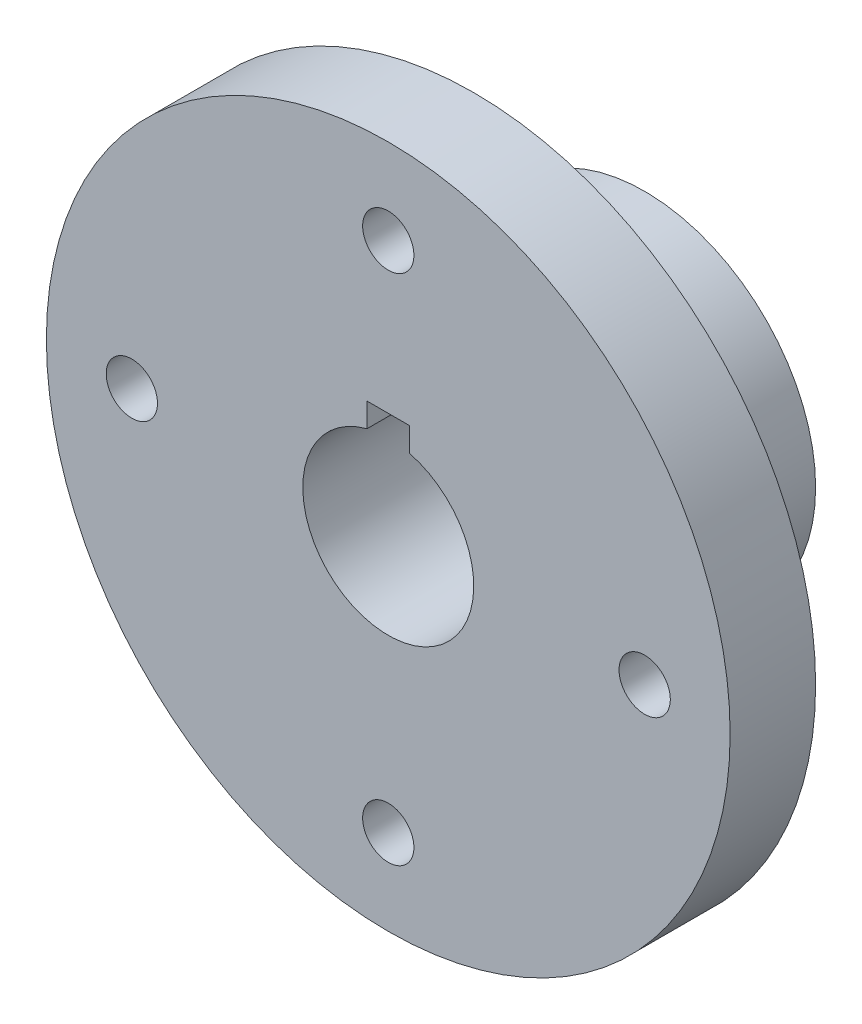
ISO-10303-21;
HEADER;
FILE_DESCRIPTION(('STEP AP214'),'2;1');
FILE_NAME('part.step','',(''),(''),'','','');
FILE_SCHEMA(('AUTOMOTIVE_DESIGN { 1 0 10303 214 1 1 1 1 }'));
ENDSEC;
DATA;
#1=APPLICATION_CONTEXT('core data for automotive mechanical design processes');
#2=APPLICATION_PROTOCOL_DEFINITION('international standard','automotive_design',2000,#1);
#3=PRODUCT_CONTEXT('',#1,'mechanical');
#4=PRODUCT('Part','Part','',(#3));
#5=PRODUCT_RELATED_PRODUCT_CATEGORY('part','',(#4));
#6=PRODUCT_DEFINITION_FORMATION('','',#4);
#7=PRODUCT_DEFINITION_CONTEXT('part definition',#1,'design');
#8=PRODUCT_DEFINITION('design','',#6,#7);
#9=PRODUCT_DEFINITION_SHAPE('','',#8);
#10=(LENGTH_UNIT() NAMED_UNIT(*) SI_UNIT(.MILLI.,.METRE.));
#11=(NAMED_UNIT(*) PLANE_ANGLE_UNIT() SI_UNIT($,.RADIAN.));
#12=(NAMED_UNIT(*) SI_UNIT($,.STERADIAN.) SOLID_ANGLE_UNIT());
#13=UNCERTAINTY_MEASURE_WITH_UNIT(LENGTH_MEASURE(1.E-05),#10,'distance_accuracy_value','');
#14=(GEOMETRIC_REPRESENTATION_CONTEXT(3) GLOBAL_UNCERTAINTY_ASSIGNED_CONTEXT((#13)) GLOBAL_UNIT_ASSIGNED_CONTEXT((#10,
#11,#12)) REPRESENTATION_CONTEXT('',''));
#15=CARTESIAN_POINT('',(0.,0.,0.));
#16=DIRECTION('',(0.,0.,1.));
#17=DIRECTION('',(1.,0.,0.));
#18=AXIS2_PLACEMENT_3D('',#15,#16,#17);
#19=CARTESIAN_POINT('',(0.,0.,50.));
#20=DIRECTION('',(0.,0.,-1.));
#21=DIRECTION('',(-1.,0.,0.));
#22=AXIS2_PLACEMENT_3D('',#19,#20,#21);
#23=CYLINDRICAL_SURFACE('',#22,200.);
#24=CARTESIAN_POINT('',(0.,0.,50.));
#25=DIRECTION('',(0.,0.,1.));
#26=DIRECTION('',(1.,0.,0.));
#27=AXIS2_PLACEMENT_3D('',#24,#25,#26);
#28=CIRCLE('',#27,200.);
#29=CARTESIAN_POINT('',(200.,0.,50.));
#30=VERTEX_POINT('',#29);
#31=EDGE_CURVE('E153',#30,#30,#28,.T.);
#32=ORIENTED_EDGE('',*,*,#31,.F.);
#33=EDGE_LOOP('',(#32));
#34=FACE_BOUND('',#33,.T.);
#35=CARTESIAN_POINT('',(0.,0.,0.));
#36=DIRECTION('',(0.,0.,1.));
#37=DIRECTION('',(1.,0.,0.));
#38=AXIS2_PLACEMENT_3D('',#35,#36,#37);
#39=CIRCLE('',#38,200.);
#40=CARTESIAN_POINT('',(200.,0.,0.));
#41=VERTEX_POINT('',#40);
#42=EDGE_CURVE('E147',#41,#41,#39,.T.);
#43=ORIENTED_EDGE('',*,*,#42,.T.);
#44=EDGE_LOOP('',(#43));
#45=FACE_BOUND('',#44,.T.);
#46=ADVANCED_FACE('F43',(#34,#45),#23,.T.);
#47=CARTESIAN_POINT('',(0.,0.,50.));
#48=DIRECTION('',(0.,0.,1.));
#49=DIRECTION('',(1.,0.,0.));
#50=AXIS2_PLACEMENT_3D('',#47,#48,#49);
#51=PLANE('',#50);
#52=DIRECTION('',(0.,1.,0.));
#53=VECTOR('',#52,1.);
#54=CARTESIAN_POINT('',(12.5,62.5,50.));
#55=LINE('',#54,#53);
#56=CARTESIAN_POINT('',(12.5,48.4122918275927,50.));
#57=VERTEX_POINT('',#56);
#58=CARTESIAN_POINT('',(12.5,62.5,50.));
#59=VERTEX_POINT('',#58);
#60=EDGE_CURVE('E87',#57,#59,#55,.T.);
#61=ORIENTED_EDGE('',*,*,#60,.F.);
#62=CARTESIAN_POINT('',(0.,0.,50.));
#63=DIRECTION('',(0.,0.,1.));
#64=DIRECTION('',(1.,0.,0.));
#65=AXIS2_PLACEMENT_3D('',#62,#63,#64);
#66=CIRCLE('',#65,50.);
#67=CARTESIAN_POINT('',(-12.5,48.4122918275927,50.));
#68=VERTEX_POINT('',#67);
#69=EDGE_CURVE('E119',#68,#57,#66,.T.);
#70=ORIENTED_EDGE('',*,*,#69,.F.);
#71=DIRECTION('',(0.,-1.,0.));
#72=VECTOR('',#71,1.);
#73=CARTESIAN_POINT('',(-12.5,62.5,50.));
#74=LINE('',#73,#72);
#75=CARTESIAN_POINT('',(-12.5,62.5,50.));
#76=VERTEX_POINT('',#75);
#77=EDGE_CURVE('E58',#76,#68,#74,.T.);
#78=ORIENTED_EDGE('',*,*,#77,.F.);
#79=DIRECTION('',(-1.,0.,0.));
#80=VECTOR('',#79,1.);
#81=CARTESIAN_POINT('',(-12.5,62.5,50.));
#82=LINE('',#81,#80);
#83=EDGE_CURVE('E109',#59,#76,#82,.T.);
#84=ORIENTED_EDGE('',*,*,#83,.F.);
#85=EDGE_LOOP('',(#61,#70,#78,#84));
#86=FACE_BOUND('',#85,.T.);
#87=CARTESIAN_POINT('',(0.,150.,50.));
#88=DIRECTION('',(0.,0.,1.));
#89=DIRECTION('',(1.,0.,0.));
#90=AXIS2_PLACEMENT_3D('',#87,#88,#89);
#91=CIRCLE('',#90,15.);
#92=CARTESIAN_POINT('',(15.,150.,50.));
#93=VERTEX_POINT('',#92);
#94=EDGE_CURVE('E127',#93,#93,#91,.T.);
#95=ORIENTED_EDGE('',*,*,#94,.F.);
#96=EDGE_LOOP('',(#95));
#97=FACE_BOUND('',#96,.T.);
#98=CARTESIAN_POINT('',(150.000000000004,4.23570186157978E-12,50.));
#99=DIRECTION('',(0.,0.,1.));
#100=DIRECTION('',(1.,0.,0.));
#101=AXIS2_PLACEMENT_3D('',#98,#99,#100);
#102=CIRCLE('',#101,15.0000000000033);
#103=CARTESIAN_POINT('',(165.000000000008,4.23570186157978E-12,50.));
#104=VERTEX_POINT('',#103);
#105=EDGE_CURVE('E132',#104,#104,#102,.T.);
#106=ORIENTED_EDGE('',*,*,#105,.F.);
#107=EDGE_LOOP('',(#106));
#108=FACE_BOUND('',#107,.T.);
#109=CARTESIAN_POINT('',(8.47140372315957E-12,-150.,50.));
#110=DIRECTION('',(0.,0.,1.));
#111=DIRECTION('',(1.,0.,0.));
#112=AXIS2_PLACEMENT_3D('',#109,#110,#111);
#113=CIRCLE('',#112,15.0000000000091);
#114=CARTESIAN_POINT('',(15.0000000000176,-150.,50.));
#115=VERTEX_POINT('',#114);
#116=EDGE_CURVE('E136',#115,#115,#113,.T.);
#117=ORIENTED_EDGE('',*,*,#116,.F.);
#118=EDGE_LOOP('',(#117));
#119=FACE_BOUND('',#118,.T.);
#120=CARTESIAN_POINT('',(-149.999999999996,-4.254071563567E-12,50.));
#121=DIRECTION('',(0.,0.,1.));
#122=DIRECTION('',(1.,0.,0.));
#123=AXIS2_PLACEMENT_3D('',#120,#121,#122);
#124=CIRCLE('',#123,15.0000000000068);
#125=CARTESIAN_POINT('',(-134.999999999989,-4.254071563567E-12,50.));
#126=VERTEX_POINT('',#125);
#127=EDGE_CURVE('E123',#126,#126,#124,.T.);
#128=ORIENTED_EDGE('',*,*,#127,.F.);
#129=EDGE_LOOP('',(#128));
#130=FACE_BOUND('',#129,.T.);
#131=ORIENTED_EDGE('',*,*,#31,.T.);
#132=EDGE_LOOP('',(#131));
#133=FACE_BOUND('',#132,.T.);
#134=ADVANCED_FACE('F178',(#86,#97,#108,#119,#130,#133),#51,.T.);
#135=CARTESIAN_POINT('',(0.,0.,0.));
#136=DIRECTION('',(0.,0.,1.));
#137=DIRECTION('',(1.,0.,0.));
#138=AXIS2_PLACEMENT_3D('',#135,#136,#137);
#139=PLANE('',#138);
#140=CARTESIAN_POINT('',(0.,150.,0.));
#141=DIRECTION('',(0.,0.,1.));
#142=DIRECTION('',(1.,0.,0.));
#143=AXIS2_PLACEMENT_3D('',#140,#141,#142);
#144=CIRCLE('',#143,15.);
#145=CARTESIAN_POINT('',(15.,150.,0.));
#146=VERTEX_POINT('',#145);
#147=EDGE_CURVE('E148',#146,#146,#144,.T.);
#148=ORIENTED_EDGE('',*,*,#147,.T.);
#149=EDGE_LOOP('',(#148));
#150=FACE_BOUND('',#149,.T.);
#151=CARTESIAN_POINT('',(150.000000000004,4.23570186157978E-12,0.));
#152=DIRECTION('',(0.,0.,1.));
#153=DIRECTION('',(1.,0.,0.));
#154=AXIS2_PLACEMENT_3D('',#151,#152,#153);
#155=CIRCLE('',#154,15.0000000000033);
#156=CARTESIAN_POINT('',(165.000000000008,4.23570186157978E-12,0.));
#157=VERTEX_POINT('',#156);
#158=EDGE_CURVE('E167',#157,#157,#155,.T.);
#159=ORIENTED_EDGE('',*,*,#158,.T.);
#160=EDGE_LOOP('',(#159));
#161=FACE_BOUND('',#160,.T.);
#162=CARTESIAN_POINT('',(8.47140372315957E-12,-150.,0.));
#163=DIRECTION('',(0.,0.,1.));
#164=DIRECTION('',(1.,0.,0.));
#165=AXIS2_PLACEMENT_3D('',#162,#163,#164);
#166=CIRCLE('',#165,15.0000000000091);
#167=CARTESIAN_POINT('',(15.0000000000176,-150.,0.));
#168=VERTEX_POINT('',#167);
#169=EDGE_CURVE('E163',#168,#168,#166,.T.);
#170=ORIENTED_EDGE('',*,*,#169,.T.);
#171=EDGE_LOOP('',(#170));
#172=FACE_BOUND('',#171,.T.);
#173=CARTESIAN_POINT('',(-149.999999999996,-4.254071563567E-12,0.));
#174=DIRECTION('',(0.,0.,1.));
#175=DIRECTION('',(1.,0.,0.));
#176=AXIS2_PLACEMENT_3D('',#173,#174,#175);
#177=CIRCLE('',#176,15.0000000000068);
#178=CARTESIAN_POINT('',(-134.999999999989,-4.254071563567E-12,0.));
#179=VERTEX_POINT('',#178);
#180=EDGE_CURVE('E131',#179,#179,#177,.T.);
#181=ORIENTED_EDGE('',*,*,#180,.T.);
#182=EDGE_LOOP('',(#181));
#183=FACE_BOUND('',#182,.T.);
#184=CARTESIAN_POINT('',(0.,0.,0.));
#185=DIRECTION('',(0.,0.,-1.));
#186=DIRECTION('',(-1.,0.,0.));
#187=AXIS2_PLACEMENT_3D('',#184,#185,#186);
#188=CIRCLE('',#187,100.);
#189=CARTESIAN_POINT('',(100.,0.,0.));
#190=VERTEX_POINT('',#189);
#191=EDGE_CURVE('E149',#190,#190,#188,.T.);
#192=ORIENTED_EDGE('',*,*,#191,.F.);
#193=EDGE_LOOP('',(#192));
#194=FACE_BOUND('',#193,.T.);
#195=ORIENTED_EDGE('',*,*,#42,.F.);
#196=EDGE_LOOP('',(#195));
#197=FACE_BOUND('',#196,.T.);
#198=ADVANCED_FACE('F181',(#150,#161,#172,#183,#194,#197),#139,.F.);
#199=CARTESIAN_POINT('',(0.,0.,-100.));
#200=DIRECTION('',(0.,0.,1.));
#201=DIRECTION('',(1.,0.,0.));
#202=AXIS2_PLACEMENT_3D('',#199,#200,#201);
#203=CYLINDRICAL_SURFACE('',#202,100.);
#204=CARTESIAN_POINT('',(0.,0.,-100.));
#205=DIRECTION('',(0.,0.,-1.));
#206=DIRECTION('',(-1.,0.,0.));
#207=AXIS2_PLACEMENT_3D('',#204,#205,#206);
#208=CIRCLE('',#207,100.);
#209=CARTESIAN_POINT('',(100.,0.,-100.));
#210=VERTEX_POINT('',#209);
#211=EDGE_CURVE('E143',#210,#210,#208,.T.);
#212=CARTESIAN_POINT('',(100.,0.,-100.));
#213=CARTESIAN_POINT('',(100.,0.,-98.9583333333333));
#214=CARTESIAN_POINT('',(100.,0.,-97.9166666666667));
#215=CARTESIAN_POINT('',(100.,0.,-95.8333333333333));
#216=CARTESIAN_POINT('',(100.,0.,-94.7916666666666));
#217=CARTESIAN_POINT('',(100.,0.,-92.7083333333333));
#218=CARTESIAN_POINT('',(100.,0.,-91.6666666666666));
#219=CARTESIAN_POINT('',(100.,0.,-89.5833333333333));
#220=CARTESIAN_POINT('',(100.,0.,-88.5416666666666));
#221=CARTESIAN_POINT('',(100.,0.,-86.4583333333333));
#222=CARTESIAN_POINT('',(100.,0.,-85.4166666666667));
#223=CARTESIAN_POINT('',(100.,0.,-83.3333333333333));
#224=CARTESIAN_POINT('',(100.,0.,-82.2916666666667));
#225=CARTESIAN_POINT('',(100.,0.,-80.2083333333333));
#226=CARTESIAN_POINT('',(100.,0.,-79.1666666666666));
#227=CARTESIAN_POINT('',(100.,0.,-77.0833333333333));
#228=CARTESIAN_POINT('',(100.,0.,-76.0416666666666));
#229=CARTESIAN_POINT('',(100.,0.,-73.9583333333333));
#230=CARTESIAN_POINT('',(100.,0.,-72.9166666666667));
#231=CARTESIAN_POINT('',(100.,0.,-70.8333333333333));
#232=CARTESIAN_POINT('',(100.,0.,-69.7916666666667));
#233=CARTESIAN_POINT('',(100.,0.,-67.7083333333333));
#234=CARTESIAN_POINT('',(100.,0.,-66.6666666666667));
#235=CARTESIAN_POINT('',(100.,0.,-64.5833333333333));
#236=CARTESIAN_POINT('',(100.,0.,-63.5416666666667));
#237=CARTESIAN_POINT('',(100.,0.,-61.4583333333333));
#238=CARTESIAN_POINT('',(100.,0.,-60.4166666666667));
#239=CARTESIAN_POINT('',(100.,0.,-58.3333333333333));
#240=CARTESIAN_POINT('',(100.,0.,-57.2916666666667));
#241=CARTESIAN_POINT('',(100.,0.,-55.2083333333333));
#242=CARTESIAN_POINT('',(100.,0.,-54.1666666666667));
#243=CARTESIAN_POINT('',(100.,0.,-52.0833333333333));
#244=CARTESIAN_POINT('',(100.,0.,-51.0416666666667));
#245=CARTESIAN_POINT('',(100.,0.,-48.9583333333333));
#246=CARTESIAN_POINT('',(100.,0.,-47.9166666666667));
#247=CARTESIAN_POINT('',(100.,0.,-45.8333333333333));
#248=CARTESIAN_POINT('',(100.,0.,-44.7916666666667));
#249=CARTESIAN_POINT('',(100.,0.,-42.7083333333333));
#250=CARTESIAN_POINT('',(100.,0.,-41.6666666666667));
#251=CARTESIAN_POINT('',(100.,0.,-39.5833333333333));
#252=CARTESIAN_POINT('',(100.,0.,-38.5416666666667));
#253=CARTESIAN_POINT('',(100.,0.,-36.4583333333333));
#254=CARTESIAN_POINT('',(100.,0.,-35.4166666666667));
#255=CARTESIAN_POINT('',(100.,0.,-33.3333333333333));
#256=CARTESIAN_POINT('',(100.,0.,-32.2916666666667));
#257=CARTESIAN_POINT('',(100.,0.,-30.2083333333333));
#258=CARTESIAN_POINT('',(100.,0.,-29.1666666666667));
#259=CARTESIAN_POINT('',(100.,0.,-27.0833333333333));
#260=CARTESIAN_POINT('',(100.,0.,-26.0416666666667));
#261=CARTESIAN_POINT('',(100.,0.,-23.9583333333333));
#262=CARTESIAN_POINT('',(100.,0.,-22.9166666666667));
#263=CARTESIAN_POINT('',(100.,0.,-20.8333333333333));
#264=CARTESIAN_POINT('',(100.,0.,-19.7916666666667));
#265=CARTESIAN_POINT('',(100.,0.,-17.7083333333333));
#266=CARTESIAN_POINT('',(100.,0.,-16.6666666666667));
#267=CARTESIAN_POINT('',(100.,0.,-14.5833333333333));
#268=CARTESIAN_POINT('',(100.,0.,-13.5416666666667));
#269=CARTESIAN_POINT('',(100.,0.,-11.4583333333333));
#270=CARTESIAN_POINT('',(100.,0.,-10.4166666666667));
#271=CARTESIAN_POINT('',(100.,0.,-8.33333333333333));
#272=CARTESIAN_POINT('',(100.,0.,-7.29166666666667));
#273=CARTESIAN_POINT('',(100.,0.,-5.20833333333334));
#274=CARTESIAN_POINT('',(100.,0.,-4.16666666666667));
#275=CARTESIAN_POINT('',(100.,0.,-2.08333333333334));
#276=CARTESIAN_POINT('',(100.,0.,-1.04166666666667));
#277=CARTESIAN_POINT('',(100.,0.,0.));
#278=B_SPLINE_CURVE_WITH_KNOTS('',3,(#212,#213,#214,#215,#216,#217,#218,#219,#220,#221,#222,
#223,#224,#225,#226,#227,#228,#229,#230,#231,#232,#233,#234,#235,#236,#237,#238,#239,#240,#241,
#242,#243,#244,#245,#246,#247,#248,#249,#250,#251,#252,#253,#254,#255,#256,#257,#258,#259,#260,
#261,#262,#263,#264,#265,#266,#267,#268,#269,#270,#271,#272,#273,#274,#275,#276,#277),
.UNSPECIFIED.,.F.,.F.,(4,2,2,2,2,2,2,2,2,2,2,2,2,2,2,2,2,2,2,2,2,2,2,2,2,2,2,2,2,2,2,2,4),(0.,
3.125,6.25000000000001,9.37500000000001,12.5,15.625,18.75,21.875,25.,28.125,31.25,34.375,37.5,
40.625,43.75,46.875,50.,53.125,56.25,59.375,62.5,65.625,68.75,71.875,75.,78.125,81.25,84.375,
87.5,90.625,93.75,96.875,100.),.UNSPECIFIED.);
#279=EDGE_CURVE('BSEAM198',#210,#190,#278,.T.);
#280=ORIENTED_EDGE('',*,*,#211,.F.);
#281=ORIENTED_EDGE('',*,*,#191,.T.);
#282=ORIENTED_EDGE('',*,*,#279,.T.);
#283=ORIENTED_EDGE('',*,*,#279,.F.);
#284=EDGE_LOOP('',(#280,#282,#281,#283));
#285=FACE_BOUND('',#284,.T.);
#286=ADVANCED_FACE('F198',(#285),#203,.T.);
#287=CARTESIAN_POINT('',(0.,0.,-100.));
#288=DIRECTION('',(0.,0.,-1.));
#289=DIRECTION('',(-1.,0.,0.));
#290=AXIS2_PLACEMENT_3D('',#287,#288,#289);
#291=PLANE('',#290);
#292=DIRECTION('',(0.,1.,0.));
#293=VECTOR('',#292,1.);
#294=CARTESIAN_POINT('',(12.5,62.5,-100.));
#295=LINE('',#294,#293);
#296=CARTESIAN_POINT('',(12.5,48.4122918275927,-100.));
#297=VERTEX_POINT('',#296);
#298=CARTESIAN_POINT('',(12.5,62.5,-100.));
#299=VERTEX_POINT('',#298);
#300=EDGE_CURVE('E85',#297,#299,#295,.T.);
#301=ORIENTED_EDGE('',*,*,#300,.T.);
#302=DIRECTION('',(-1.,0.,0.));
#303=VECTOR('',#302,1.);
#304=CARTESIAN_POINT('',(-12.5,62.5,-100.));
#305=LINE('',#304,#303);
#306=CARTESIAN_POINT('',(-12.5,62.5,-100.));
#307=VERTEX_POINT('',#306);
#308=EDGE_CURVE('E96',#299,#307,#305,.T.);
#309=ORIENTED_EDGE('',*,*,#308,.T.);
#310=DIRECTION('',(0.,-1.,0.));
#311=VECTOR('',#310,1.);
#312=CARTESIAN_POINT('',(-12.5,62.5,-100.));
#313=LINE('',#312,#311);
#314=CARTESIAN_POINT('',(-12.5,48.4122918275927,-100.));
#315=VERTEX_POINT('',#314);
#316=EDGE_CURVE('E93',#307,#315,#313,.T.);
#317=ORIENTED_EDGE('',*,*,#316,.T.);
#318=CARTESIAN_POINT('',(0.,0.,-100.));
#319=DIRECTION('',(0.,0.,1.));
#320=DIRECTION('',(1.,0.,0.));
#321=AXIS2_PLACEMENT_3D('',#318,#319,#320);
#322=CIRCLE('',#321,50.);
#323=EDGE_CURVE('E105',#315,#297,#322,.T.);
#324=ORIENTED_EDGE('',*,*,#323,.T.);
#325=EDGE_LOOP('',(#301,#309,#317,#324));
#326=FACE_BOUND('',#325,.T.);
#327=ORIENTED_EDGE('',*,*,#211,.T.);
#328=EDGE_LOOP('',(#327));
#329=FACE_BOUND('',#328,.T.);
#330=ADVANCED_FACE('F102',(#326,#329),#291,.T.);
#331=CARTESIAN_POINT('',(-149.999999999996,-4.254071563567E-12,-50.));
#332=DIRECTION('',(0.,0.,1.));
#333=DIRECTION('',(1.,0.,0.));
#334=AXIS2_PLACEMENT_3D('',#331,#332,#333);
#335=CYLINDRICAL_SURFACE('',#334,15.0000000000068);
#336=CARTESIAN_POINT('',(-134.999999999989,-4.254071563567E-12,50.));
#337=CARTESIAN_POINT('',(-134.999999999989,-4.254071563567E-12,49.4791666666667));
#338=CARTESIAN_POINT('',(-134.999999999989,-4.254071563567E-12,48.9583333333333));
#339=CARTESIAN_POINT('',(-134.999999999989,-4.254071563567E-12,47.9166666666667));
#340=CARTESIAN_POINT('',(-134.999999999989,-4.254071563567E-12,47.3958333333333));
#341=CARTESIAN_POINT('',(-134.999999999989,-4.254071563567E-12,46.3541666666667));
#342=CARTESIAN_POINT('',(-134.999999999989,-4.254071563567E-12,45.8333333333333));
#343=CARTESIAN_POINT('',(-134.999999999989,-4.254071563567E-12,44.7916666666667));
#344=CARTESIAN_POINT('',(-134.999999999989,-4.254071563567E-12,44.2708333333333));
#345=CARTESIAN_POINT('',(-134.999999999989,-4.254071563567E-12,43.2291666666667));
#346=CARTESIAN_POINT('',(-134.999999999989,-4.254071563567E-12,42.7083333333333));
#347=CARTESIAN_POINT('',(-134.999999999989,-4.254071563567E-12,41.6666666666667));
#348=CARTESIAN_POINT('',(-134.999999999989,-4.254071563567E-12,41.1458333333333));
#349=CARTESIAN_POINT('',(-134.999999999989,-4.254071563567E-12,40.1041666666667));
#350=CARTESIAN_POINT('',(-134.999999999989,-4.254071563567E-12,39.5833333333333));
#351=CARTESIAN_POINT('',(-134.999999999989,-4.254071563567E-12,38.5416666666667));
#352=CARTESIAN_POINT('',(-134.999999999989,-4.254071563567E-12,38.0208333333333));
#353=CARTESIAN_POINT('',(-134.999999999989,-4.254071563567E-12,36.9791666666667));
#354=CARTESIAN_POINT('',(-134.999999999989,-4.254071563567E-12,36.4583333333333));
#355=CARTESIAN_POINT('',(-134.999999999989,-4.254071563567E-12,35.4166666666667));
#356=CARTESIAN_POINT('',(-134.999999999989,-4.254071563567E-12,34.8958333333333));
#357=CARTESIAN_POINT('',(-134.999999999989,-4.254071563567E-12,33.8541666666667));
#358=CARTESIAN_POINT('',(-134.999999999989,-4.254071563567E-12,33.3333333333333));
#359=CARTESIAN_POINT('',(-134.999999999989,-4.254071563567E-12,32.2916666666667));
#360=CARTESIAN_POINT('',(-134.999999999989,-4.254071563567E-12,31.7708333333333));
#361=CARTESIAN_POINT('',(-134.999999999989,-4.254071563567E-12,30.7291666666667));
#362=CARTESIAN_POINT('',(-134.999999999989,-4.254071563567E-12,30.2083333333333));
#363=CARTESIAN_POINT('',(-134.999999999989,-4.254071563567E-12,29.1666666666667));
#364=CARTESIAN_POINT('',(-134.999999999989,-4.254071563567E-12,28.6458333333333));
#365=CARTESIAN_POINT('',(-134.999999999989,-4.254071563567E-12,27.6041666666667));
#366=CARTESIAN_POINT('',(-134.999999999989,-4.254071563567E-12,27.0833333333333));
#367=CARTESIAN_POINT('',(-134.999999999989,-4.254071563567E-12,26.0416666666667));
#368=CARTESIAN_POINT('',(-134.999999999989,-4.254071563567E-12,25.5208333333333));
#369=CARTESIAN_POINT('',(-134.999999999989,-4.254071563567E-12,24.4791666666667));
#370=CARTESIAN_POINT('',(-134.999999999989,-4.254071563567E-12,23.9583333333333));
#371=CARTESIAN_POINT('',(-134.999999999989,-4.254071563567E-12,22.9166666666667));
#372=CARTESIAN_POINT('',(-134.999999999989,-4.254071563567E-12,22.3958333333333));
#373=CARTESIAN_POINT('',(-134.999999999989,-4.254071563567E-12,21.3541666666667));
#374=CARTESIAN_POINT('',(-134.999999999989,-4.254071563567E-12,20.8333333333333));
#375=CARTESIAN_POINT('',(-134.999999999989,-4.254071563567E-12,19.7916666666667));
#376=CARTESIAN_POINT('',(-134.999999999989,-4.254071563567E-12,19.2708333333333));
#377=CARTESIAN_POINT('',(-134.999999999989,-4.254071563567E-12,18.2291666666667));
#378=CARTESIAN_POINT('',(-134.999999999989,-4.254071563567E-12,17.7083333333333));
#379=CARTESIAN_POINT('',(-134.999999999989,-4.254071563567E-12,16.6666666666667));
#380=CARTESIAN_POINT('',(-134.999999999989,-4.254071563567E-12,16.1458333333333));
#381=CARTESIAN_POINT('',(-134.999999999989,-4.254071563567E-12,15.1041666666667));
#382=CARTESIAN_POINT('',(-134.999999999989,-4.254071563567E-12,14.5833333333333));
#383=CARTESIAN_POINT('',(-134.999999999989,-4.254071563567E-12,13.5416666666667));
#384=CARTESIAN_POINT('',(-134.999999999989,-4.254071563567E-12,13.0208333333333));
#385=CARTESIAN_POINT('',(-134.999999999989,-4.254071563567E-12,11.9791666666667));
#386=CARTESIAN_POINT('',(-134.999999999989,-4.254071563567E-12,11.4583333333333));
#387=CARTESIAN_POINT('',(-134.999999999989,-4.254071563567E-12,10.4166666666667));
#388=CARTESIAN_POINT('',(-134.999999999989,-4.254071563567E-12,9.89583333333333));
#389=CARTESIAN_POINT('',(-134.999999999989,-4.254071563567E-12,8.85416666666666));
#390=CARTESIAN_POINT('',(-134.999999999989,-4.254071563567E-12,8.33333333333333));
#391=CARTESIAN_POINT('',(-134.999999999989,-4.254071563567E-12,7.29166666666666));
#392=CARTESIAN_POINT('',(-134.999999999989,-4.254071563567E-12,6.77083333333333));
#393=CARTESIAN_POINT('',(-134.999999999989,-4.254071563567E-12,5.72916666666666));
#394=CARTESIAN_POINT('',(-134.999999999989,-4.254071563567E-12,5.20833333333333));
#395=CARTESIAN_POINT('',(-134.999999999989,-4.254071563567E-12,4.16666666666666));
#396=CARTESIAN_POINT('',(-134.999999999989,-4.254071563567E-12,3.64583333333333));
#397=CARTESIAN_POINT('',(-134.999999999989,-4.254071563567E-12,2.60416666666666));
#398=CARTESIAN_POINT('',(-134.999999999989,-4.254071563567E-12,2.08333333333333));
#399=CARTESIAN_POINT('',(-134.999999999989,-4.254071563567E-12,1.04166666666666));
#400=CARTESIAN_POINT('',(-134.999999999989,-4.254071563567E-12,0.520833333333327));
#401=CARTESIAN_POINT('',(-134.999999999989,-4.254071563567E-12,0.));
#402=B_SPLINE_CURVE_WITH_KNOTS('',3,(#336,#337,#338,#339,#340,#341,#342,#343,#344,#345,#346,
#347,#348,#349,#350,#351,#352,#353,#354,#355,#356,#357,#358,#359,#360,#361,#362,#363,#364,#365,
#366,#367,#368,#369,#370,#371,#372,#373,#374,#375,#376,#377,#378,#379,#380,#381,#382,#383,#384,
#385,#386,#387,#388,#389,#390,#391,#392,#393,#394,#395,#396,#397,#398,#399,#400,#401),
.UNSPECIFIED.,.F.,.F.,(4,2,2,2,2,2,2,2,2,2,2,2,2,2,2,2,2,2,2,2,2,2,2,2,2,2,2,2,2,2,2,2,4),(0.,
1.56249999999999,3.125,4.6875,6.25000000000001,7.8125,9.37500000000001,10.9375,12.5,14.0625,
15.625,17.1875,18.75,20.3125,21.875,23.4375,25.,26.5625,28.125,29.6875,31.25,32.8125,34.375,
35.9375,37.5,39.0625,40.625,42.1875,43.75,45.3125,46.875,48.4375,50.),.UNSPECIFIED.);
#403=EDGE_CURVE('BSEAM209',#126,#179,#402,.T.);
#404=ORIENTED_EDGE('',*,*,#127,.T.);
#405=ORIENTED_EDGE('',*,*,#180,.F.);
#406=ORIENTED_EDGE('',*,*,#403,.T.);
#407=ORIENTED_EDGE('',*,*,#403,.F.);
#408=EDGE_LOOP('',(#404,#406,#405,#407));
#409=FACE_BOUND('',#408,.T.);
#410=ADVANCED_FACE('F209',(#409),#335,.F.);
#411=CARTESIAN_POINT('',(8.47140372315957E-12,-150.,-50.));
#412=DIRECTION('',(0.,0.,1.));
#413=DIRECTION('',(1.,0.,0.));
#414=AXIS2_PLACEMENT_3D('',#411,#412,#413);
#415=CYLINDRICAL_SURFACE('',#414,15.0000000000091);
#416=CARTESIAN_POINT('',(15.0000000000176,-150.,50.));
#417=CARTESIAN_POINT('',(15.0000000000176,-150.,49.4791666666667));
#418=CARTESIAN_POINT('',(15.0000000000176,-150.,48.9583333333333));
#419=CARTESIAN_POINT('',(15.0000000000176,-150.,47.9166666666667));
#420=CARTESIAN_POINT('',(15.0000000000176,-150.,47.3958333333333));
#421=CARTESIAN_POINT('',(15.0000000000176,-150.,46.3541666666667));
#422=CARTESIAN_POINT('',(15.0000000000176,-150.,45.8333333333333));
#423=CARTESIAN_POINT('',(15.0000000000176,-150.,44.7916666666667));
#424=CARTESIAN_POINT('',(15.0000000000176,-150.,44.2708333333333));
#425=CARTESIAN_POINT('',(15.0000000000176,-150.,43.2291666666667));
#426=CARTESIAN_POINT('',(15.0000000000176,-150.,42.7083333333333));
#427=CARTESIAN_POINT('',(15.0000000000176,-150.,41.6666666666667));
#428=CARTESIAN_POINT('',(15.0000000000176,-150.,41.1458333333333));
#429=CARTESIAN_POINT('',(15.0000000000176,-150.,40.1041666666667));
#430=CARTESIAN_POINT('',(15.0000000000176,-150.,39.5833333333333));
#431=CARTESIAN_POINT('',(15.0000000000176,-150.,38.5416666666667));
#432=CARTESIAN_POINT('',(15.0000000000176,-150.,38.0208333333333));
#433=CARTESIAN_POINT('',(15.0000000000176,-150.,36.9791666666667));
#434=CARTESIAN_POINT('',(15.0000000000176,-150.,36.4583333333333));
#435=CARTESIAN_POINT('',(15.0000000000176,-150.,35.4166666666667));
#436=CARTESIAN_POINT('',(15.0000000000176,-150.,34.8958333333333));
#437=CARTESIAN_POINT('',(15.0000000000176,-150.,33.8541666666667));
#438=CARTESIAN_POINT('',(15.0000000000176,-150.,33.3333333333333));
#439=CARTESIAN_POINT('',(15.0000000000176,-150.,32.2916666666667));
#440=CARTESIAN_POINT('',(15.0000000000176,-150.,31.7708333333333));
#441=CARTESIAN_POINT('',(15.0000000000176,-150.,30.7291666666667));
#442=CARTESIAN_POINT('',(15.0000000000176,-150.,30.2083333333333));
#443=CARTESIAN_POINT('',(15.0000000000176,-150.,29.1666666666667));
#444=CARTESIAN_POINT('',(15.0000000000176,-150.,28.6458333333333));
#445=CARTESIAN_POINT('',(15.0000000000176,-150.,27.6041666666667));
#446=CARTESIAN_POINT('',(15.0000000000176,-150.,27.0833333333333));
#447=CARTESIAN_POINT('',(15.0000000000176,-150.,26.0416666666667));
#448=CARTESIAN_POINT('',(15.0000000000176,-150.,25.5208333333333));
#449=CARTESIAN_POINT('',(15.0000000000176,-150.,24.4791666666667));
#450=CARTESIAN_POINT('',(15.0000000000176,-150.,23.9583333333333));
#451=CARTESIAN_POINT('',(15.0000000000176,-150.,22.9166666666667));
#452=CARTESIAN_POINT('',(15.0000000000176,-150.,22.3958333333333));
#453=CARTESIAN_POINT('',(15.0000000000176,-150.,21.3541666666667));
#454=CARTESIAN_POINT('',(15.0000000000176,-150.,20.8333333333333));
#455=CARTESIAN_POINT('',(15.0000000000176,-150.,19.7916666666667));
#456=CARTESIAN_POINT('',(15.0000000000176,-150.,19.2708333333333));
#457=CARTESIAN_POINT('',(15.0000000000176,-150.,18.2291666666667));
#458=CARTESIAN_POINT('',(15.0000000000176,-150.,17.7083333333333));
#459=CARTESIAN_POINT('',(15.0000000000176,-150.,16.6666666666667));
#460=CARTESIAN_POINT('',(15.0000000000176,-150.,16.1458333333333));
#461=CARTESIAN_POINT('',(15.0000000000176,-150.,15.1041666666667));
#462=CARTESIAN_POINT('',(15.0000000000176,-150.,14.5833333333333));
#463=CARTESIAN_POINT('',(15.0000000000176,-150.,13.5416666666667));
#464=CARTESIAN_POINT('',(15.0000000000176,-150.,13.0208333333333));
#465=CARTESIAN_POINT('',(15.0000000000176,-150.,11.9791666666667));
#466=CARTESIAN_POINT('',(15.0000000000176,-150.,11.4583333333333));
#467=CARTESIAN_POINT('',(15.0000000000176,-150.,10.4166666666667));
#468=CARTESIAN_POINT('',(15.0000000000176,-150.,9.89583333333333));
#469=CARTESIAN_POINT('',(15.0000000000176,-150.,8.85416666666666));
#470=CARTESIAN_POINT('',(15.0000000000176,-150.,8.33333333333333));
#471=CARTESIAN_POINT('',(15.0000000000176,-150.,7.29166666666666));
#472=CARTESIAN_POINT('',(15.0000000000176,-150.,6.77083333333333));
#473=CARTESIAN_POINT('',(15.0000000000176,-150.,5.72916666666666));
#474=CARTESIAN_POINT('',(15.0000000000176,-150.,5.20833333333333));
#475=CARTESIAN_POINT('',(15.0000000000176,-150.,4.16666666666666));
#476=CARTESIAN_POINT('',(15.0000000000176,-150.,3.64583333333333));
#477=CARTESIAN_POINT('',(15.0000000000176,-150.,2.60416666666666));
#478=CARTESIAN_POINT('',(15.0000000000176,-150.,2.08333333333333));
#479=CARTESIAN_POINT('',(15.0000000000176,-150.,1.04166666666666));
#480=CARTESIAN_POINT('',(15.0000000000176,-150.,0.520833333333327));
#481=CARTESIAN_POINT('',(15.0000000000176,-150.,0.));
#482=B_SPLINE_CURVE_WITH_KNOTS('',3,(#416,#417,#418,#419,#420,#421,#422,#423,#424,#425,#426,
#427,#428,#429,#430,#431,#432,#433,#434,#435,#436,#437,#438,#439,#440,#441,#442,#443,#444,#445,
#446,#447,#448,#449,#450,#451,#452,#453,#454,#455,#456,#457,#458,#459,#460,#461,#462,#463,#464,
#465,#466,#467,#468,#469,#470,#471,#472,#473,#474,#475,#476,#477,#478,#479,#480,#481),
.UNSPECIFIED.,.F.,.F.,(4,2,2,2,2,2,2,2,2,2,2,2,2,2,2,2,2,2,2,2,2,2,2,2,2,2,2,2,2,2,2,2,4),(0.,
1.56249999999999,3.125,4.6875,6.25000000000001,7.8125,9.37500000000001,10.9375,12.5,14.0625,
15.625,17.1875,18.75,20.3125,21.875,23.4375,25.,26.5625,28.125,29.6875,31.25,32.8125,34.375,
35.9375,37.5,39.0625,40.625,42.1875,43.75,45.3125,46.875,48.4375,50.),.UNSPECIFIED.);
#483=EDGE_CURVE('BSEAM212',#115,#168,#482,.T.);
#484=ORIENTED_EDGE('',*,*,#116,.T.);
#485=ORIENTED_EDGE('',*,*,#169,.F.);
#486=ORIENTED_EDGE('',*,*,#483,.T.);
#487=ORIENTED_EDGE('',*,*,#483,.F.);
#488=EDGE_LOOP('',(#484,#486,#485,#487));
#489=FACE_BOUND('',#488,.T.);
#490=ADVANCED_FACE('F212',(#489),#415,.F.);
#491=CARTESIAN_POINT('',(150.000000000004,4.23570186157978E-12,-50.));
#492=DIRECTION('',(0.,0.,1.));
#493=DIRECTION('',(1.,0.,0.));
#494=AXIS2_PLACEMENT_3D('',#491,#492,#493);
#495=CYLINDRICAL_SURFACE('',#494,15.0000000000033);
#496=CARTESIAN_POINT('',(165.000000000008,4.23570186157978E-12,50.));
#497=CARTESIAN_POINT('',(165.000000000008,4.23570186157978E-12,49.4791666666667));
#498=CARTESIAN_POINT('',(165.000000000008,4.23570186157978E-12,48.9583333333333));
#499=CARTESIAN_POINT('',(165.000000000008,4.23570186157978E-12,47.9166666666667));
#500=CARTESIAN_POINT('',(165.000000000008,4.23570186157978E-12,47.3958333333333));
#501=CARTESIAN_POINT('',(165.000000000008,4.23570186157978E-12,46.3541666666667));
#502=CARTESIAN_POINT('',(165.000000000008,4.23570186157978E-12,45.8333333333333));
#503=CARTESIAN_POINT('',(165.000000000008,4.23570186157978E-12,44.7916666666667));
#504=CARTESIAN_POINT('',(165.000000000008,4.23570186157978E-12,44.2708333333333));
#505=CARTESIAN_POINT('',(165.000000000008,4.23570186157978E-12,43.2291666666667));
#506=CARTESIAN_POINT('',(165.000000000008,4.23570186157978E-12,42.7083333333333));
#507=CARTESIAN_POINT('',(165.000000000008,4.23570186157978E-12,41.6666666666667));
#508=CARTESIAN_POINT('',(165.000000000008,4.23570186157978E-12,41.1458333333333));
#509=CARTESIAN_POINT('',(165.000000000008,4.23570186157978E-12,40.1041666666667));
#510=CARTESIAN_POINT('',(165.000000000008,4.23570186157978E-12,39.5833333333333));
#511=CARTESIAN_POINT('',(165.000000000008,4.23570186157978E-12,38.5416666666667));
#512=CARTESIAN_POINT('',(165.000000000008,4.23570186157978E-12,38.0208333333333));
#513=CARTESIAN_POINT('',(165.000000000008,4.23570186157978E-12,36.9791666666667));
#514=CARTESIAN_POINT('',(165.000000000008,4.23570186157978E-12,36.4583333333333));
#515=CARTESIAN_POINT('',(165.000000000008,4.23570186157978E-12,35.4166666666667));
#516=CARTESIAN_POINT('',(165.000000000008,4.23570186157978E-12,34.8958333333333));
#517=CARTESIAN_POINT('',(165.000000000008,4.23570186157978E-12,33.8541666666667));
#518=CARTESIAN_POINT('',(165.000000000008,4.23570186157978E-12,33.3333333333333));
#519=CARTESIAN_POINT('',(165.000000000008,4.23570186157978E-12,32.2916666666667));
#520=CARTESIAN_POINT('',(165.000000000008,4.23570186157978E-12,31.7708333333333));
#521=CARTESIAN_POINT('',(165.000000000008,4.23570186157978E-12,30.7291666666667));
#522=CARTESIAN_POINT('',(165.000000000008,4.23570186157978E-12,30.2083333333333));
#523=CARTESIAN_POINT('',(165.000000000008,4.23570186157978E-12,29.1666666666667));
#524=CARTESIAN_POINT('',(165.000000000008,4.23570186157978E-12,28.6458333333333));
#525=CARTESIAN_POINT('',(165.000000000008,4.23570186157978E-12,27.6041666666667));
#526=CARTESIAN_POINT('',(165.000000000008,4.23570186157978E-12,27.0833333333333));
#527=CARTESIAN_POINT('',(165.000000000008,4.23570186157978E-12,26.0416666666667));
#528=CARTESIAN_POINT('',(165.000000000008,4.23570186157978E-12,25.5208333333333));
#529=CARTESIAN_POINT('',(165.000000000008,4.23570186157978E-12,24.4791666666667));
#530=CARTESIAN_POINT('',(165.000000000008,4.23570186157978E-12,23.9583333333333));
#531=CARTESIAN_POINT('',(165.000000000008,4.23570186157978E-12,22.9166666666667));
#532=CARTESIAN_POINT('',(165.000000000008,4.23570186157978E-12,22.3958333333333));
#533=CARTESIAN_POINT('',(165.000000000008,4.23570186157978E-12,21.3541666666667));
#534=CARTESIAN_POINT('',(165.000000000008,4.23570186157978E-12,20.8333333333333));
#535=CARTESIAN_POINT('',(165.000000000008,4.23570186157978E-12,19.7916666666667));
#536=CARTESIAN_POINT('',(165.000000000008,4.23570186157978E-12,19.2708333333333));
#537=CARTESIAN_POINT('',(165.000000000008,4.23570186157978E-12,18.2291666666667));
#538=CARTESIAN_POINT('',(165.000000000008,4.23570186157978E-12,17.7083333333333));
#539=CARTESIAN_POINT('',(165.000000000008,4.23570186157978E-12,16.6666666666667));
#540=CARTESIAN_POINT('',(165.000000000008,4.23570186157978E-12,16.1458333333333));
#541=CARTESIAN_POINT('',(165.000000000008,4.23570186157978E-12,15.1041666666667));
#542=CARTESIAN_POINT('',(165.000000000008,4.23570186157978E-12,14.5833333333333));
#543=CARTESIAN_POINT('',(165.000000000008,4.23570186157978E-12,13.5416666666667));
#544=CARTESIAN_POINT('',(165.000000000008,4.23570186157978E-12,13.0208333333333));
#545=CARTESIAN_POINT('',(165.000000000008,4.23570186157978E-12,11.9791666666667));
#546=CARTESIAN_POINT('',(165.000000000008,4.23570186157978E-12,11.4583333333333));
#547=CARTESIAN_POINT('',(165.000000000008,4.23570186157978E-12,10.4166666666667));
#548=CARTESIAN_POINT('',(165.000000000008,4.23570186157978E-12,9.89583333333333));
#549=CARTESIAN_POINT('',(165.000000000008,4.23570186157978E-12,8.85416666666666));
#550=CARTESIAN_POINT('',(165.000000000008,4.23570186157978E-12,8.33333333333333));
#551=CARTESIAN_POINT('',(165.000000000008,4.23570186157978E-12,7.29166666666666));
#552=CARTESIAN_POINT('',(165.000000000008,4.23570186157978E-12,6.77083333333333));
#553=CARTESIAN_POINT('',(165.000000000008,4.23570186157978E-12,5.72916666666666));
#554=CARTESIAN_POINT('',(165.000000000008,4.23570186157978E-12,5.20833333333333));
#555=CARTESIAN_POINT('',(165.000000000008,4.23570186157978E-12,4.16666666666666));
#556=CARTESIAN_POINT('',(165.000000000008,4.23570186157978E-12,3.64583333333333));
#557=CARTESIAN_POINT('',(165.000000000008,4.23570186157978E-12,2.60416666666666));
#558=CARTESIAN_POINT('',(165.000000000008,4.23570186157978E-12,2.08333333333333));
#559=CARTESIAN_POINT('',(165.000000000008,4.23570186157978E-12,1.04166666666666));
#560=CARTESIAN_POINT('',(165.000000000008,4.23570186157978E-12,0.520833333333327));
#561=CARTESIAN_POINT('',(165.000000000008,4.23570186157978E-12,0.));
#562=B_SPLINE_CURVE_WITH_KNOTS('',3,(#496,#497,#498,#499,#500,#501,#502,#503,#504,#505,#506,
#507,#508,#509,#510,#511,#512,#513,#514,#515,#516,#517,#518,#519,#520,#521,#522,#523,#524,#525,
#526,#527,#528,#529,#530,#531,#532,#533,#534,#535,#536,#537,#538,#539,#540,#541,#542,#543,#544,
#545,#546,#547,#548,#549,#550,#551,#552,#553,#554,#555,#556,#557,#558,#559,#560,#561),
.UNSPECIFIED.,.F.,.F.,(4,2,2,2,2,2,2,2,2,2,2,2,2,2,2,2,2,2,2,2,2,2,2,2,2,2,2,2,2,2,2,2,4),(0.,
1.56249999999999,3.125,4.6875,6.25000000000001,7.8125,9.37500000000001,10.9375,12.5,14.0625,
15.625,17.1875,18.75,20.3125,21.875,23.4375,25.,26.5625,28.125,29.6875,31.25,32.8125,34.375,
35.9375,37.5,39.0625,40.625,42.1875,43.75,45.3125,46.875,48.4375,50.),.UNSPECIFIED.);
#563=EDGE_CURVE('BSEAM216',#104,#157,#562,.T.);
#564=ORIENTED_EDGE('',*,*,#105,.T.);
#565=ORIENTED_EDGE('',*,*,#158,.F.);
#566=ORIENTED_EDGE('',*,*,#563,.T.);
#567=ORIENTED_EDGE('',*,*,#563,.F.);
#568=EDGE_LOOP('',(#564,#566,#565,#567));
#569=FACE_BOUND('',#568,.T.);
#570=ADVANCED_FACE('F216',(#569),#495,.F.);
#571=CARTESIAN_POINT('',(0.,150.,-50.));
#572=DIRECTION('',(0.,0.,1.));
#573=DIRECTION('',(1.,0.,0.));
#574=AXIS2_PLACEMENT_3D('',#571,#572,#573);
#575=CYLINDRICAL_SURFACE('',#574,15.);
#576=CARTESIAN_POINT('',(15.,150.,50.));
#577=CARTESIAN_POINT('',(15.,150.,49.4791666666667));
#578=CARTESIAN_POINT('',(15.,150.,48.9583333333333));
#579=CARTESIAN_POINT('',(15.,150.,47.9166666666667));
#580=CARTESIAN_POINT('',(15.,150.,47.3958333333333));
#581=CARTESIAN_POINT('',(15.,150.,46.3541666666667));
#582=CARTESIAN_POINT('',(15.,150.,45.8333333333333));
#583=CARTESIAN_POINT('',(15.,150.,44.7916666666667));
#584=CARTESIAN_POINT('',(15.,150.,44.2708333333333));
#585=CARTESIAN_POINT('',(15.,150.,43.2291666666667));
#586=CARTESIAN_POINT('',(15.,150.,42.7083333333333));
#587=CARTESIAN_POINT('',(15.,150.,41.6666666666667));
#588=CARTESIAN_POINT('',(15.,150.,41.1458333333333));
#589=CARTESIAN_POINT('',(15.,150.,40.1041666666667));
#590=CARTESIAN_POINT('',(15.,150.,39.5833333333333));
#591=CARTESIAN_POINT('',(15.,150.,38.5416666666667));
#592=CARTESIAN_POINT('',(15.,150.,38.0208333333333));
#593=CARTESIAN_POINT('',(15.,150.,36.9791666666667));
#594=CARTESIAN_POINT('',(15.,150.,36.4583333333333));
#595=CARTESIAN_POINT('',(15.,150.,35.4166666666667));
#596=CARTESIAN_POINT('',(15.,150.,34.8958333333333));
#597=CARTESIAN_POINT('',(15.,150.,33.8541666666667));
#598=CARTESIAN_POINT('',(15.,150.,33.3333333333333));
#599=CARTESIAN_POINT('',(15.,150.,32.2916666666667));
#600=CARTESIAN_POINT('',(15.,150.,31.7708333333333));
#601=CARTESIAN_POINT('',(15.,150.,30.7291666666667));
#602=CARTESIAN_POINT('',(15.,150.,30.2083333333333));
#603=CARTESIAN_POINT('',(15.,150.,29.1666666666667));
#604=CARTESIAN_POINT('',(15.,150.,28.6458333333333));
#605=CARTESIAN_POINT('',(15.,150.,27.6041666666667));
#606=CARTESIAN_POINT('',(15.,150.,27.0833333333333));
#607=CARTESIAN_POINT('',(15.,150.,26.0416666666667));
#608=CARTESIAN_POINT('',(15.,150.,25.5208333333333));
#609=CARTESIAN_POINT('',(15.,150.,24.4791666666667));
#610=CARTESIAN_POINT('',(15.,150.,23.9583333333333));
#611=CARTESIAN_POINT('',(15.,150.,22.9166666666667));
#612=CARTESIAN_POINT('',(15.,150.,22.3958333333333));
#613=CARTESIAN_POINT('',(15.,150.,21.3541666666667));
#614=CARTESIAN_POINT('',(15.,150.,20.8333333333333));
#615=CARTESIAN_POINT('',(15.,150.,19.7916666666667));
#616=CARTESIAN_POINT('',(15.,150.,19.2708333333333));
#617=CARTESIAN_POINT('',(15.,150.,18.2291666666667));
#618=CARTESIAN_POINT('',(15.,150.,17.7083333333333));
#619=CARTESIAN_POINT('',(15.,150.,16.6666666666667));
#620=CARTESIAN_POINT('',(15.,150.,16.1458333333333));
#621=CARTESIAN_POINT('',(15.,150.,15.1041666666667));
#622=CARTESIAN_POINT('',(15.,150.,14.5833333333333));
#623=CARTESIAN_POINT('',(15.,150.,13.5416666666667));
#624=CARTESIAN_POINT('',(15.,150.,13.0208333333333));
#625=CARTESIAN_POINT('',(15.,150.,11.9791666666667));
#626=CARTESIAN_POINT('',(15.,150.,11.4583333333333));
#627=CARTESIAN_POINT('',(15.,150.,10.4166666666667));
#628=CARTESIAN_POINT('',(15.,150.,9.89583333333333));
#629=CARTESIAN_POINT('',(15.,150.,8.85416666666666));
#630=CARTESIAN_POINT('',(15.,150.,8.33333333333333));
#631=CARTESIAN_POINT('',(15.,150.,7.29166666666666));
#632=CARTESIAN_POINT('',(15.,150.,6.77083333333333));
#633=CARTESIAN_POINT('',(15.,150.,5.72916666666666));
#634=CARTESIAN_POINT('',(15.,150.,5.20833333333333));
#635=CARTESIAN_POINT('',(15.,150.,4.16666666666666));
#636=CARTESIAN_POINT('',(15.,150.,3.64583333333333));
#637=CARTESIAN_POINT('',(15.,150.,2.60416666666666));
#638=CARTESIAN_POINT('',(15.,150.,2.08333333333333));
#639=CARTESIAN_POINT('',(15.,150.,1.04166666666666));
#640=CARTESIAN_POINT('',(15.,150.,0.520833333333327));
#641=CARTESIAN_POINT('',(15.,150.,0.));
#642=B_SPLINE_CURVE_WITH_KNOTS('',3,(#576,#577,#578,#579,#580,#581,#582,#583,#584,#585,#586,
#587,#588,#589,#590,#591,#592,#593,#594,#595,#596,#597,#598,#599,#600,#601,#602,#603,#604,#605,
#606,#607,#608,#609,#610,#611,#612,#613,#614,#615,#616,#617,#618,#619,#620,#621,#622,#623,#624,
#625,#626,#627,#628,#629,#630,#631,#632,#633,#634,#635,#636,#637,#638,#639,#640,#641),
.UNSPECIFIED.,.F.,.F.,(4,2,2,2,2,2,2,2,2,2,2,2,2,2,2,2,2,2,2,2,2,2,2,2,2,2,2,2,2,2,2,2,4),(0.,
1.56249999999999,3.125,4.6875,6.25000000000001,7.8125,9.37500000000001,10.9375,12.5,14.0625,
15.625,17.1875,18.75,20.3125,21.875,23.4375,25.,26.5625,28.125,29.6875,31.25,32.8125,34.375,
35.9375,37.5,39.0625,40.625,42.1875,43.75,45.3125,46.875,48.4375,50.),.UNSPECIFIED.);
#643=EDGE_CURVE('BSEAM220',#93,#146,#642,.T.);
#644=ORIENTED_EDGE('',*,*,#94,.T.);
#645=ORIENTED_EDGE('',*,*,#147,.F.);
#646=ORIENTED_EDGE('',*,*,#643,.T.);
#647=ORIENTED_EDGE('',*,*,#643,.F.);
#648=EDGE_LOOP('',(#644,#646,#645,#647));
#649=FACE_BOUND('',#648,.T.);
#650=ADVANCED_FACE('F220',(#649),#575,.F.);
#651=CARTESIAN_POINT('',(0.,0.,-100.));
#652=DIRECTION('',(0.,0.,1.));
#653=DIRECTION('',(1.,0.,0.));
#654=AXIS2_PLACEMENT_3D('',#651,#652,#653);
#655=CYLINDRICAL_SURFACE('',#654,50.);
#656=ORIENTED_EDGE('',*,*,#69,.T.);
#657=DIRECTION('',(0.,0.,1.));
#658=VECTOR('',#657,1.);
#659=CARTESIAN_POINT('',(12.5,48.4122918275927,-100.));
#660=LINE('',#659,#658);
#661=EDGE_CURVE('E11',#57,#297,#660,.F.);
#662=ORIENTED_EDGE('',*,*,#661,.T.);
#663=ORIENTED_EDGE('',*,*,#323,.F.);
#664=DIRECTION('',(0.,0.,1.));
#665=VECTOR('',#664,1.);
#666=CARTESIAN_POINT('',(-12.5,48.4122918275927,-100.));
#667=LINE('',#666,#665);
#668=EDGE_CURVE('E51',#315,#68,#667,.T.);
#669=ORIENTED_EDGE('',*,*,#668,.T.);
#670=EDGE_LOOP('',(#656,#662,#663,#669));
#671=FACE_BOUND('',#670,.T.);
#672=ADVANCED_FACE('F176',(#671),#655,.F.);
#673=CARTESIAN_POINT('',(12.5,62.5,-100.));
#674=DIRECTION('',(1.,0.,0.));
#675=DIRECTION('',(0.,1.,0.));
#676=AXIS2_PLACEMENT_3D('',#673,#674,#675);
#677=PLANE('',#676);
#678=ORIENTED_EDGE('',*,*,#60,.T.);
#679=DIRECTION('',(0.,0.,1.));
#680=VECTOR('',#679,1.);
#681=CARTESIAN_POINT('',(12.5,62.5,-100.));
#682=LINE('',#681,#680);
#683=EDGE_CURVE('E81',#299,#59,#682,.T.);
#684=ORIENTED_EDGE('',*,*,#683,.F.);
#685=ORIENTED_EDGE('',*,*,#300,.F.);
#686=ORIENTED_EDGE('',*,*,#661,.F.);
#687=EDGE_LOOP('',(#678,#684,#685,#686));
#688=FACE_BOUND('',#687,.T.);
#689=ADVANCED_FACE('F83',(#688),#677,.F.);
#690=CARTESIAN_POINT('',(-12.5,62.5,-100.));
#691=DIRECTION('',(-1.,0.,0.));
#692=DIRECTION('',(0.,-1.,0.));
#693=AXIS2_PLACEMENT_3D('',#690,#691,#692);
#694=PLANE('',#693);
#695=ORIENTED_EDGE('',*,*,#316,.F.);
#696=DIRECTION('',(0.,0.,1.));
#697=VECTOR('',#696,1.);
#698=CARTESIAN_POINT('',(-12.5,62.5,-100.));
#699=LINE('',#698,#697);
#700=EDGE_CURVE('E92',#307,#76,#699,.T.);
#701=ORIENTED_EDGE('',*,*,#700,.T.);
#702=ORIENTED_EDGE('',*,*,#77,.T.);
#703=ORIENTED_EDGE('',*,*,#668,.F.);
#704=EDGE_LOOP('',(#695,#701,#702,#703));
#705=FACE_BOUND('',#704,.T.);
#706=ADVANCED_FACE('F229',(#705),#694,.F.);
#707=CARTESIAN_POINT('',(-12.5,62.5,-100.));
#708=DIRECTION('',(0.,1.,0.));
#709=DIRECTION('',(0.,0.,1.));
#710=AXIS2_PLACEMENT_3D('',#707,#708,#709);
#711=PLANE('',#710);
#712=ORIENTED_EDGE('',*,*,#83,.T.);
#713=ORIENTED_EDGE('',*,*,#700,.F.);
#714=ORIENTED_EDGE('',*,*,#308,.F.);
#715=ORIENTED_EDGE('',*,*,#683,.T.);
#716=EDGE_LOOP('',(#712,#713,#714,#715));
#717=FACE_BOUND('',#716,.T.);
#718=ADVANCED_FACE('F97',(#717),#711,.F.);
#719=CLOSED_SHELL('',(#46,#134,#198,#286,#330,#410,#490,#570,#650,#672,#689,#706,#718));
#720=MANIFOLD_SOLID_BREP('B2',#719);
#721=ADVANCED_BREP_SHAPE_REPRESENTATION('',(#18,#720),#14);
#722=SHAPE_DEFINITION_REPRESENTATION(#9,#721);
ENDSEC;
END-ISO-10303-21;
